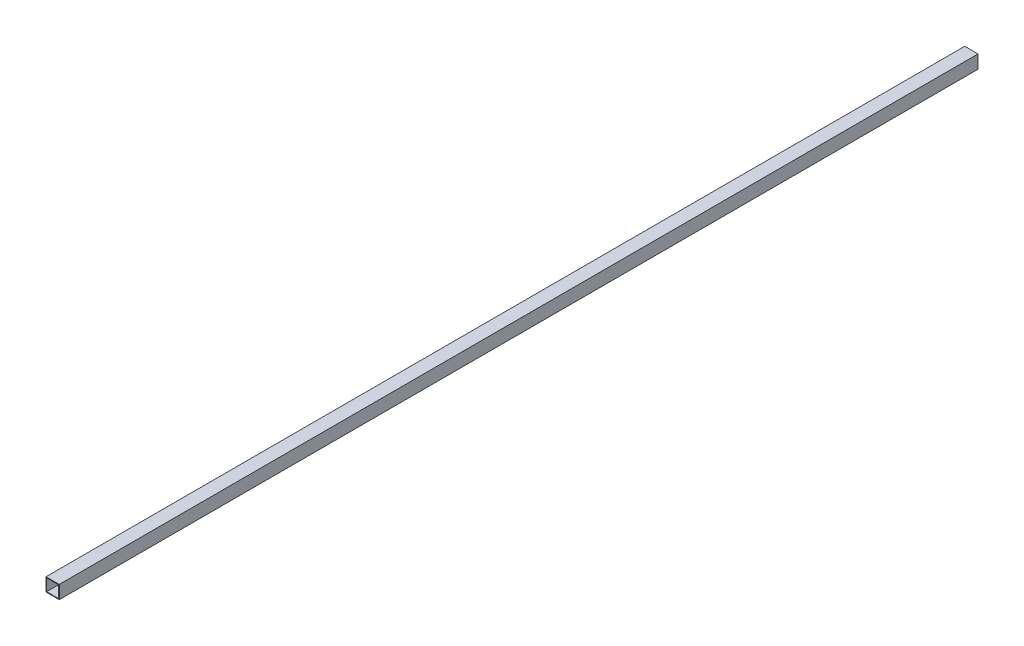
ISO-10303-21;
HEADER;
FILE_DESCRIPTION(('STEP AP214'),'2;1');
FILE_NAME('part.step','',(''),(''),'','','');
FILE_SCHEMA(('AUTOMOTIVE_DESIGN { 1 0 10303 214 1 1 1 1 }'));
ENDSEC;
DATA;
#1=APPLICATION_CONTEXT('core data for automotive mechanical design processes');
#2=APPLICATION_PROTOCOL_DEFINITION('international standard','automotive_design',2000,#1);
#3=PRODUCT_CONTEXT('',#1,'mechanical');
#4=PRODUCT('Part','Part','',(#3));
#5=PRODUCT_RELATED_PRODUCT_CATEGORY('part','',(#4));
#6=PRODUCT_DEFINITION_FORMATION('','',#4);
#7=PRODUCT_DEFINITION_CONTEXT('part definition',#1,'design');
#8=PRODUCT_DEFINITION('design','',#6,#7);
#9=PRODUCT_DEFINITION_SHAPE('','',#8);
#10=(LENGTH_UNIT() NAMED_UNIT(*) SI_UNIT(.MILLI.,.METRE.));
#11=(NAMED_UNIT(*) PLANE_ANGLE_UNIT() SI_UNIT($,.RADIAN.));
#12=(NAMED_UNIT(*) SI_UNIT($,.STERADIAN.) SOLID_ANGLE_UNIT());
#13=UNCERTAINTY_MEASURE_WITH_UNIT(LENGTH_MEASURE(1.E-05),#10,'distance_accuracy_value','');
#14=(GEOMETRIC_REPRESENTATION_CONTEXT(3) GLOBAL_UNCERTAINTY_ASSIGNED_CONTEXT((#13)) GLOBAL_UNIT_ASSIGNED_CONTEXT((#10,
#11,#12)) REPRESENTATION_CONTEXT('',''));
#15=CARTESIAN_POINT('',(0.,0.,0.));
#16=DIRECTION('',(0.,0.,1.));
#17=DIRECTION('',(1.,0.,0.));
#18=AXIS2_PLACEMENT_3D('',#15,#16,#17);
#19=CARTESIAN_POINT('',(0.,0.,2200.));
#20=DIRECTION('',(0.,0.,1.));
#21=DIRECTION('',(1.,0.,0.));
#22=AXIS2_PLACEMENT_3D('',#19,#20,#21);
#23=PLANE('',#22);
#24=DIRECTION('',(0.,1.,0.));
#25=VECTOR('',#24,1.);
#26=CARTESIAN_POINT('',(15.875,15.875,2200.));
#27=LINE('',#26,#25);
#28=CARTESIAN_POINT('',(15.875,-15.875,2200.));
#29=VERTEX_POINT('',#28);
#30=CARTESIAN_POINT('',(15.875,15.875,2200.));
#31=VERTEX_POINT('',#30);
#32=EDGE_CURVE('E134',#29,#31,#27,.T.);
#33=ORIENTED_EDGE('',*,*,#32,.T.);
#34=DIRECTION('',(-1.,0.,0.));
#35=VECTOR('',#34,1.);
#36=CARTESIAN_POINT('',(-15.875,15.875,2200.));
#37=LINE('',#36,#35);
#38=CARTESIAN_POINT('',(-15.875,15.875,2200.));
#39=VERTEX_POINT('',#38);
#40=EDGE_CURVE('E137',#31,#39,#37,.T.);
#41=ORIENTED_EDGE('',*,*,#40,.T.);
#42=DIRECTION('',(0.,-1.,0.));
#43=VECTOR('',#42,1.);
#44=CARTESIAN_POINT('',(-15.875,15.875,2200.));
#45=LINE('',#44,#43);
#46=CARTESIAN_POINT('',(-15.875,-15.875,2200.));
#47=VERTEX_POINT('',#46);
#48=EDGE_CURVE('E140',#39,#47,#45,.T.);
#49=ORIENTED_EDGE('',*,*,#48,.T.);
#50=DIRECTION('',(1.,0.,0.));
#51=VECTOR('',#50,1.);
#52=CARTESIAN_POINT('',(-15.875,-15.875,2200.));
#53=LINE('',#52,#51);
#54=EDGE_CURVE('E142',#47,#29,#53,.T.);
#55=ORIENTED_EDGE('',*,*,#54,.T.);
#56=EDGE_LOOP('',(#33,#41,#49,#55));
#57=FACE_BOUND('',#56,.T.);
#58=DIRECTION('',(-1.,0.,0.));
#59=VECTOR('',#58,1.);
#60=CARTESIAN_POINT('',(-14.2875,14.2875,2200.));
#61=LINE('',#60,#59);
#62=CARTESIAN_POINT('',(14.2875,14.2875,2200.));
#63=VERTEX_POINT('',#62);
#64=CARTESIAN_POINT('',(-14.2875,14.2875,2200.));
#65=VERTEX_POINT('',#64);
#66=EDGE_CURVE('E106',#63,#65,#61,.T.);
#67=ORIENTED_EDGE('',*,*,#66,.F.);
#68=DIRECTION('',(0.,1.,0.));
#69=VECTOR('',#68,1.);
#70=CARTESIAN_POINT('',(14.2875,14.2875,2200.));
#71=LINE('',#70,#69);
#72=CARTESIAN_POINT('',(14.2875,-14.2875,2200.));
#73=VERTEX_POINT('',#72);
#74=EDGE_CURVE('E98',#73,#63,#71,.T.);
#75=ORIENTED_EDGE('',*,*,#74,.F.);
#76=DIRECTION('',(1.,0.,0.));
#77=VECTOR('',#76,1.);
#78=CARTESIAN_POINT('',(-14.2875,-14.2875,2200.));
#79=LINE('',#78,#77);
#80=CARTESIAN_POINT('',(-14.2875,-14.2875,2200.));
#81=VERTEX_POINT('',#80);
#82=EDGE_CURVE('E120',#81,#73,#79,.T.);
#83=ORIENTED_EDGE('',*,*,#82,.F.);
#84=DIRECTION('',(0.,-1.,0.));
#85=VECTOR('',#84,1.);
#86=CARTESIAN_POINT('',(-14.2875,14.2875,2200.));
#87=LINE('',#86,#85);
#88=EDGE_CURVE('E118',#65,#81,#87,.T.);
#89=ORIENTED_EDGE('',*,*,#88,.F.);
#90=EDGE_LOOP('',(#67,#75,#83,#89));
#91=FACE_BOUND('',#90,.T.);
#92=ADVANCED_FACE('F33',(#57,#91),#23,.T.);
#93=CARTESIAN_POINT('',(0.,0.,0.));
#94=DIRECTION('',(0.,0.,1.));
#95=DIRECTION('',(1.,0.,0.));
#96=AXIS2_PLACEMENT_3D('',#93,#94,#95);
#97=PLANE('',#96);
#98=DIRECTION('',(0.,1.,0.));
#99=VECTOR('',#98,1.);
#100=CARTESIAN_POINT('',(15.875,15.875,0.));
#101=LINE('',#100,#99);
#102=CARTESIAN_POINT('',(15.875,-15.875,0.));
#103=VERTEX_POINT('',#102);
#104=CARTESIAN_POINT('',(15.875,15.875,0.));
#105=VERTEX_POINT('',#104);
#106=EDGE_CURVE('E114',#103,#105,#101,.T.);
#107=ORIENTED_EDGE('',*,*,#106,.F.);
#108=DIRECTION('',(1.,0.,0.));
#109=VECTOR('',#108,1.);
#110=CARTESIAN_POINT('',(-15.875,-15.875,0.));
#111=LINE('',#110,#109);
#112=CARTESIAN_POINT('',(-15.875,-15.875,0.));
#113=VERTEX_POINT('',#112);
#114=EDGE_CURVE('E138',#113,#103,#111,.T.);
#115=ORIENTED_EDGE('',*,*,#114,.F.);
#116=DIRECTION('',(0.,-1.,0.));
#117=VECTOR('',#116,1.);
#118=CARTESIAN_POINT('',(-15.875,15.875,0.));
#119=LINE('',#118,#117);
#120=CARTESIAN_POINT('',(-15.875,15.875,0.));
#121=VERTEX_POINT('',#120);
#122=EDGE_CURVE('E149',#121,#113,#119,.T.);
#123=ORIENTED_EDGE('',*,*,#122,.F.);
#124=DIRECTION('',(-1.,0.,0.));
#125=VECTOR('',#124,1.);
#126=CARTESIAN_POINT('',(-15.875,15.875,0.));
#127=LINE('',#126,#125);
#128=EDGE_CURVE('E147',#105,#121,#127,.T.);
#129=ORIENTED_EDGE('',*,*,#128,.F.);
#130=EDGE_LOOP('',(#107,#115,#123,#129));
#131=FACE_BOUND('',#130,.T.);
#132=DIRECTION('',(0.,1.,0.));
#133=VECTOR('',#132,1.);
#134=CARTESIAN_POINT('',(14.2875,14.2875,0.));
#135=LINE('',#134,#133);
#136=CARTESIAN_POINT('',(14.2875,-14.2875,0.));
#137=VERTEX_POINT('',#136);
#138=CARTESIAN_POINT('',(14.2875,14.2875,0.));
#139=VERTEX_POINT('',#138);
#140=EDGE_CURVE('E56',#137,#139,#135,.T.);
#141=ORIENTED_EDGE('',*,*,#140,.T.);
#142=DIRECTION('',(-1.,0.,0.));
#143=VECTOR('',#142,1.);
#144=CARTESIAN_POINT('',(-14.2875,14.2875,0.));
#145=LINE('',#144,#143);
#146=CARTESIAN_POINT('',(-14.2875,14.2875,0.));
#147=VERTEX_POINT('',#146);
#148=EDGE_CURVE('E113',#139,#147,#145,.T.);
#149=ORIENTED_EDGE('',*,*,#148,.T.);
#150=DIRECTION('',(0.,-1.,0.));
#151=VECTOR('',#150,1.);
#152=CARTESIAN_POINT('',(-14.2875,14.2875,0.));
#153=LINE('',#152,#151);
#154=CARTESIAN_POINT('',(-14.2875,-14.2875,0.));
#155=VERTEX_POINT('',#154);
#156=EDGE_CURVE('E126',#147,#155,#153,.T.);
#157=ORIENTED_EDGE('',*,*,#156,.T.);
#158=DIRECTION('',(1.,0.,0.));
#159=VECTOR('',#158,1.);
#160=CARTESIAN_POINT('',(-14.2875,-14.2875,0.));
#161=LINE('',#160,#159);
#162=EDGE_CURVE('E107',#155,#137,#161,.T.);
#163=ORIENTED_EDGE('',*,*,#162,.T.);
#164=EDGE_LOOP('',(#141,#149,#157,#163));
#165=FACE_BOUND('',#164,.T.);
#166=ADVANCED_FACE('F167',(#131,#165),#97,.F.);
#167=CARTESIAN_POINT('',(15.875,15.875,2200.));
#168=DIRECTION('',(-1.,0.,0.));
#169=DIRECTION('',(0.,-1.,0.));
#170=AXIS2_PLACEMENT_3D('',#167,#168,#169);
#171=PLANE('',#170);
#172=ORIENTED_EDGE('',*,*,#106,.T.);
#173=DIRECTION('',(0.,0.,-1.));
#174=VECTOR('',#173,1.);
#175=CARTESIAN_POINT('',(15.875,15.875,2200.));
#176=LINE('',#175,#174);
#177=EDGE_CURVE('E11',#31,#105,#176,.T.);
#178=ORIENTED_EDGE('',*,*,#177,.F.);
#179=ORIENTED_EDGE('',*,*,#32,.F.);
#180=DIRECTION('',(0.,0.,-1.));
#181=VECTOR('',#180,1.);
#182=CARTESIAN_POINT('',(15.875,-15.875,2200.));
#183=LINE('',#182,#181);
#184=EDGE_CURVE('E144',#29,#103,#183,.T.);
#185=ORIENTED_EDGE('',*,*,#184,.T.);
#186=EDGE_LOOP('',(#172,#178,#179,#185));
#187=FACE_BOUND('',#186,.T.);
#188=ADVANCED_FACE('F35',(#187),#171,.F.);
#189=CARTESIAN_POINT('',(-15.875,15.875,2200.));
#190=DIRECTION('',(0.,-1.,0.));
#191=DIRECTION('',(0.,0.,-1.));
#192=AXIS2_PLACEMENT_3D('',#189,#190,#191);
#193=PLANE('',#192);
#194=ORIENTED_EDGE('',*,*,#128,.T.);
#195=DIRECTION('',(0.,0.,-1.));
#196=VECTOR('',#195,1.);
#197=CARTESIAN_POINT('',(-15.875,15.875,2200.));
#198=LINE('',#197,#196);
#199=EDGE_CURVE('E41',#39,#121,#198,.T.);
#200=ORIENTED_EDGE('',*,*,#199,.F.);
#201=ORIENTED_EDGE('',*,*,#40,.F.);
#202=ORIENTED_EDGE('',*,*,#177,.T.);
#203=EDGE_LOOP('',(#194,#200,#201,#202));
#204=FACE_BOUND('',#203,.T.);
#205=ADVANCED_FACE('F177',(#204),#193,.F.);
#206=CARTESIAN_POINT('',(-15.875,15.875,2200.));
#207=DIRECTION('',(1.,0.,0.));
#208=DIRECTION('',(0.,0.,-1.));
#209=AXIS2_PLACEMENT_3D('',#206,#207,#208);
#210=PLANE('',#209);
#211=ORIENTED_EDGE('',*,*,#122,.T.);
#212=DIRECTION('',(0.,0.,-1.));
#213=VECTOR('',#212,1.);
#214=CARTESIAN_POINT('',(-15.875,-15.875,2200.));
#215=LINE('',#214,#213);
#216=EDGE_CURVE('E154',#47,#113,#215,.T.);
#217=ORIENTED_EDGE('',*,*,#216,.F.);
#218=ORIENTED_EDGE('',*,*,#48,.F.);
#219=ORIENTED_EDGE('',*,*,#199,.T.);
#220=EDGE_LOOP('',(#211,#217,#218,#219));
#221=FACE_BOUND('',#220,.T.);
#222=ADVANCED_FACE('F161',(#221),#210,.F.);
#223=CARTESIAN_POINT('',(-15.875,-15.875,2200.));
#224=DIRECTION('',(0.,1.,0.));
#225=DIRECTION('',(0.,0.,1.));
#226=AXIS2_PLACEMENT_3D('',#223,#224,#225);
#227=PLANE('',#226);
#228=ORIENTED_EDGE('',*,*,#114,.T.);
#229=ORIENTED_EDGE('',*,*,#184,.F.);
#230=ORIENTED_EDGE('',*,*,#54,.F.);
#231=ORIENTED_EDGE('',*,*,#216,.T.);
#232=EDGE_LOOP('',(#228,#229,#230,#231));
#233=FACE_BOUND('',#232,.T.);
#234=ADVANCED_FACE('F171',(#233),#227,.F.);
#235=CARTESIAN_POINT('',(14.2875,14.2875,2200.));
#236=DIRECTION('',(-1.,0.,0.));
#237=DIRECTION('',(0.,0.,1.));
#238=AXIS2_PLACEMENT_3D('',#235,#236,#237);
#239=PLANE('',#238);
#240=ORIENTED_EDGE('',*,*,#140,.F.);
#241=DIRECTION('',(0.,0.,-1.));
#242=VECTOR('',#241,1.);
#243=CARTESIAN_POINT('',(14.2875,-14.2875,2200.));
#244=LINE('',#243,#242);
#245=EDGE_CURVE('E102',#73,#137,#244,.T.);
#246=ORIENTED_EDGE('',*,*,#245,.F.);
#247=ORIENTED_EDGE('',*,*,#74,.T.);
#248=DIRECTION('',(0.,0.,-1.));
#249=VECTOR('',#248,1.);
#250=CARTESIAN_POINT('',(14.2875,14.2875,2200.));
#251=LINE('',#250,#249);
#252=EDGE_CURVE('E101',#63,#139,#251,.T.);
#253=ORIENTED_EDGE('',*,*,#252,.T.);
#254=EDGE_LOOP('',(#240,#246,#247,#253));
#255=FACE_BOUND('',#254,.T.);
#256=ADVANCED_FACE('F100',(#255),#239,.T.);
#257=CARTESIAN_POINT('',(-14.2875,14.2875,2200.));
#258=DIRECTION('',(0.,-1.,0.));
#259=DIRECTION('',(0.,0.,-1.));
#260=AXIS2_PLACEMENT_3D('',#257,#258,#259);
#261=PLANE('',#260);
#262=ORIENTED_EDGE('',*,*,#148,.F.);
#263=ORIENTED_EDGE('',*,*,#252,.F.);
#264=ORIENTED_EDGE('',*,*,#66,.T.);
#265=DIRECTION('',(0.,0.,-1.));
#266=VECTOR('',#265,1.);
#267=CARTESIAN_POINT('',(-14.2875,14.2875,2200.));
#268=LINE('',#267,#266);
#269=EDGE_CURVE('E115',#65,#147,#268,.T.);
#270=ORIENTED_EDGE('',*,*,#269,.T.);
#271=EDGE_LOOP('',(#262,#263,#264,#270));
#272=FACE_BOUND('',#271,.T.);
#273=ADVANCED_FACE('F110',(#272),#261,.T.);
#274=CARTESIAN_POINT('',(-14.2875,14.2875,2200.));
#275=DIRECTION('',(1.,0.,0.));
#276=DIRECTION('',(0.,0.,-1.));
#277=AXIS2_PLACEMENT_3D('',#274,#275,#276);
#278=PLANE('',#277);
#279=ORIENTED_EDGE('',*,*,#156,.F.);
#280=ORIENTED_EDGE('',*,*,#269,.F.);
#281=ORIENTED_EDGE('',*,*,#88,.T.);
#282=DIRECTION('',(0.,0.,-1.));
#283=VECTOR('',#282,1.);
#284=CARTESIAN_POINT('',(-14.2875,-14.2875,2200.));
#285=LINE('',#284,#283);
#286=EDGE_CURVE('E48',#81,#155,#285,.T.);
#287=ORIENTED_EDGE('',*,*,#286,.T.);
#288=EDGE_LOOP('',(#279,#280,#281,#287));
#289=FACE_BOUND('',#288,.T.);
#290=ADVANCED_FACE('F200',(#289),#278,.T.);
#291=CARTESIAN_POINT('',(-14.2875,-14.2875,2200.));
#292=DIRECTION('',(0.,1.,0.));
#293=DIRECTION('',(0.,0.,1.));
#294=AXIS2_PLACEMENT_3D('',#291,#292,#293);
#295=PLANE('',#294);
#296=ORIENTED_EDGE('',*,*,#162,.F.);
#297=ORIENTED_EDGE('',*,*,#286,.F.);
#298=ORIENTED_EDGE('',*,*,#82,.T.);
#299=ORIENTED_EDGE('',*,*,#245,.T.);
#300=EDGE_LOOP('',(#296,#297,#298,#299));
#301=FACE_BOUND('',#300,.T.);
#302=ADVANCED_FACE('F204',(#301),#295,.T.);
#303=CLOSED_SHELL('',(#92,#166,#188,#205,#222,#234,#256,#273,#290,#302));
#304=MANIFOLD_SOLID_BREP('B2',#303);
#305=ADVANCED_BREP_SHAPE_REPRESENTATION('',(#18,#304),#14);
#306=SHAPE_DEFINITION_REPRESENTATION(#9,#305);
ENDSEC;
END-ISO-10303-21;
